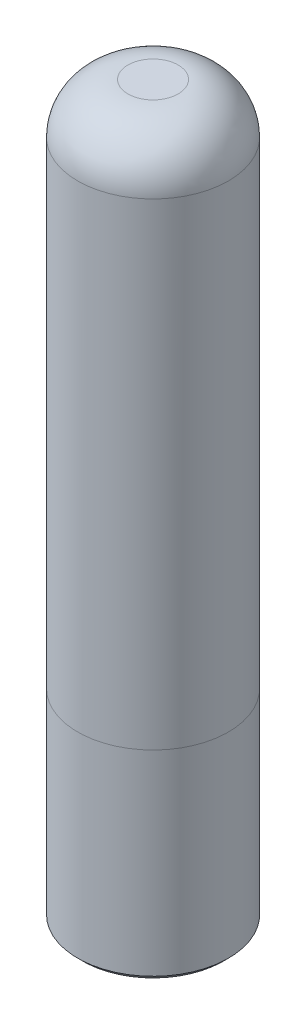
ISO-10303-21;
HEADER;
FILE_DESCRIPTION(('STEP AP214'),'2;1');
FILE_NAME('part.step','',(''),(''),'','','');
FILE_SCHEMA(('AUTOMOTIVE_DESIGN { 1 0 10303 214 1 1 1 1 }'));
ENDSEC;
DATA;
#1=APPLICATION_CONTEXT('core data for automotive mechanical design processes');
#2=APPLICATION_PROTOCOL_DEFINITION('international standard','automotive_design',2000,#1);
#3=PRODUCT_CONTEXT('',#1,'mechanical');
#4=PRODUCT('Part','Part','',(#3));
#5=PRODUCT_RELATED_PRODUCT_CATEGORY('part','',(#4));
#6=PRODUCT_DEFINITION_FORMATION('','',#4);
#7=PRODUCT_DEFINITION_CONTEXT('part definition',#1,'design');
#8=PRODUCT_DEFINITION('design','',#6,#7);
#9=PRODUCT_DEFINITION_SHAPE('','',#8);
#10=(LENGTH_UNIT() NAMED_UNIT(*) SI_UNIT(.MILLI.,.METRE.));
#11=(NAMED_UNIT(*) PLANE_ANGLE_UNIT() SI_UNIT($,.RADIAN.));
#12=(NAMED_UNIT(*) SI_UNIT($,.STERADIAN.) SOLID_ANGLE_UNIT());
#13=UNCERTAINTY_MEASURE_WITH_UNIT(LENGTH_MEASURE(1.E-05),#10,'distance_accuracy_value','');
#14=(GEOMETRIC_REPRESENTATION_CONTEXT(3) GLOBAL_UNCERTAINTY_ASSIGNED_CONTEXT((#13)) GLOBAL_UNIT_ASSIGNED_CONTEXT((#10,
#11,#12)) REPRESENTATION_CONTEXT('',''));
#15=CARTESIAN_POINT('',(0.,0.,0.));
#16=DIRECTION('',(0.,0.,1.));
#17=DIRECTION('',(1.,0.,0.));
#18=AXIS2_PLACEMENT_3D('',#15,#16,#17);
#19=CARTESIAN_POINT('',(0.,-4.,0.));
#20=DIRECTION('',(0.,1.,0.));
#21=DIRECTION('',(0.,0.,1.));
#22=AXIS2_PLACEMENT_3D('',#19,#20,#21);
#23=CYLINDRICAL_SURFACE('',#22,1.5);
#24=CARTESIAN_POINT('',(0.,-3.9,0.));
#25=DIRECTION('',(0.,-1.,0.));
#26=DIRECTION('',(0.,0.,-1.));
#27=AXIS2_PLACEMENT_3D('',#24,#25,#26);
#28=CIRCLE('',#27,1.5);
#29=CARTESIAN_POINT('',(0.,-3.9,-1.5));
#30=VERTEX_POINT('',#29);
#31=EDGE_CURVE('E11',#30,#30,#28,.F.);
#32=ORIENTED_EDGE('',*,*,#31,.T.);
#33=EDGE_LOOP('',(#32));
#34=FACE_BOUND('',#33,.T.);
#35=CARTESIAN_POINT('',(0.,0.,0.));
#36=DIRECTION('',(0.,-1.,0.));
#37=DIRECTION('',(0.,0.,-1.));
#38=AXIS2_PLACEMENT_3D('',#35,#36,#37);
#39=CIRCLE('',#38,1.5);
#40=CARTESIAN_POINT('',(0.,0.,-1.5));
#41=VERTEX_POINT('',#40);
#42=EDGE_CURVE('E61',#41,#41,#39,.T.);
#43=ORIENTED_EDGE('',*,*,#42,.T.);
#44=EDGE_LOOP('',(#43));
#45=FACE_BOUND('',#44,.T.);
#46=ADVANCED_FACE('F49',(#34,#45),#23,.T.);
#47=CARTESIAN_POINT('',(0.,-4.,0.));
#48=DIRECTION('',(0.,-1.,0.));
#49=DIRECTION('',(0.,0.,-1.));
#50=AXIS2_PLACEMENT_3D('',#47,#48,#49);
#51=PLANE('',#50);
#52=CARTESIAN_POINT('',(0.,-4.,0.));
#53=DIRECTION('',(0.,-1.,0.));
#54=DIRECTION('',(0.,0.,-1.));
#55=AXIS2_PLACEMENT_3D('',#52,#53,#54);
#56=CIRCLE('',#55,1.4);
#57=CARTESIAN_POINT('',(0.,-4.,-1.4));
#58=VERTEX_POINT('',#57);
#59=EDGE_CURVE('E57',#58,#58,#56,.T.);
#60=ORIENTED_EDGE('',*,*,#59,.T.);
#61=EDGE_LOOP('',(#60));
#62=FACE_BOUND('',#61,.T.);
#63=ADVANCED_FACE('F71',(#62),#51,.T.);
#64=CARTESIAN_POINT('',(0.,0.,0.));
#65=DIRECTION('',(0.,-1.,0.));
#66=DIRECTION('',(0.,0.,-1.));
#67=AXIS2_PLACEMENT_3D('',#64,#65,#66);
#68=PLANE('',#67);
#69=ORIENTED_EDGE('',*,*,#42,.F.);
#70=EDGE_LOOP('',(#69));
#71=FACE_BOUND('',#70,.T.);
#72=ADVANCED_FACE('F69',(#71),#68,.F.);
#73=CARTESIAN_POINT('',(0.,-4.,0.));
#74=DIRECTION('',(0.,1.,0.));
#75=DIRECTION('',(0.,0.,1.));
#76=AXIS2_PLACEMENT_3D('',#73,#74,#75);
#77=CONICAL_SURFACE('',#76,1.4,0.785398163397453);
#78=ORIENTED_EDGE('',*,*,#31,.F.);
#79=EDGE_LOOP('',(#78));
#80=FACE_BOUND('',#79,.T.);
#81=ORIENTED_EDGE('',*,*,#59,.F.);
#82=EDGE_LOOP('',(#81));
#83=FACE_BOUND('',#82,.T.);
#84=ADVANCED_FACE('F52',(#80,#83),#77,.T.);
#85=CLOSED_SHELL('',(#46,#63,#72,#84));
#86=MANIFOLD_SOLID_BREP('B2',#85);
#87=CARTESIAN_POINT('',(0.,10.5,0.));
#88=DIRECTION('',(0.,-1.,0.));
#89=DIRECTION('',(0.,0.,-1.));
#90=AXIS2_PLACEMENT_3D('',#87,#88,#89);
#91=CYLINDRICAL_SURFACE('',#90,1.5);
#92=CARTESIAN_POINT('',(0.,9.5,0.));
#93=DIRECTION('',(0.,1.,0.));
#94=DIRECTION('',(0.,0.,1.));
#95=AXIS2_PLACEMENT_3D('',#92,#93,#94);
#96=CIRCLE('',#95,1.5);
#97=CARTESIAN_POINT('',(0.,9.5,-1.5));
#98=VERTEX_POINT('',#97);
#99=EDGE_CURVE('E48',#98,#98,#96,.F.);
#100=CARTESIAN_POINT('',(0.,0.,0.));
#101=DIRECTION('',(0.,1.,0.));
#102=DIRECTION('',(0.,0.,1.));
#103=AXIS2_PLACEMENT_3D('',#100,#101,#102);
#104=CIRCLE('',#103,1.5);
#105=CARTESIAN_POINT('',(0.,0.,-1.5));
#106=VERTEX_POINT('',#105);
#107=EDGE_CURVE('E126',#106,#106,#104,.T.);
#108=CARTESIAN_POINT('',(0.,9.5,-1.5));
#109=CARTESIAN_POINT('',(0.,9.40104166666667,-1.5));
#110=CARTESIAN_POINT('',(0.,9.30208333333333,-1.5));
#111=CARTESIAN_POINT('',(0.,9.10416666666667,-1.5));
#112=CARTESIAN_POINT('',(0.,9.00520833333333,-1.5));
#113=CARTESIAN_POINT('',(0.,8.80729166666667,-1.5));
#114=CARTESIAN_POINT('',(0.,8.70833333333333,-1.5));
#115=CARTESIAN_POINT('',(0.,8.51041666666667,-1.5));
#116=CARTESIAN_POINT('',(0.,8.41145833333333,-1.5));
#117=CARTESIAN_POINT('',(0.,8.21354166666667,-1.5));
#118=CARTESIAN_POINT('',(0.,8.11458333333333,-1.5));
#119=CARTESIAN_POINT('',(0.,7.91666666666667,-1.5));
#120=CARTESIAN_POINT('',(0.,7.81770833333333,-1.5));
#121=CARTESIAN_POINT('',(0.,7.61979166666667,-1.5));
#122=CARTESIAN_POINT('',(0.,7.52083333333333,-1.5));
#123=CARTESIAN_POINT('',(0.,7.32291666666667,-1.5));
#124=CARTESIAN_POINT('',(0.,7.22395833333333,-1.5));
#125=CARTESIAN_POINT('',(0.,7.02604166666667,-1.5));
#126=CARTESIAN_POINT('',(0.,6.92708333333333,-1.5));
#127=CARTESIAN_POINT('',(0.,6.72916666666667,-1.5));
#128=CARTESIAN_POINT('',(0.,6.63020833333333,-1.5));
#129=CARTESIAN_POINT('',(0.,6.43229166666667,-1.5));
#130=CARTESIAN_POINT('',(0.,6.33333333333333,-1.5));
#131=CARTESIAN_POINT('',(0.,6.13541666666667,-1.5));
#132=CARTESIAN_POINT('',(0.,6.03645833333333,-1.5));
#133=CARTESIAN_POINT('',(0.,5.83854166666667,-1.5));
#134=CARTESIAN_POINT('',(0.,5.73958333333333,-1.5));
#135=CARTESIAN_POINT('',(0.,5.54166666666667,-1.5));
#136=CARTESIAN_POINT('',(0.,5.44270833333333,-1.5));
#137=CARTESIAN_POINT('',(0.,5.24479166666667,-1.5));
#138=CARTESIAN_POINT('',(0.,5.14583333333333,-1.5));
#139=CARTESIAN_POINT('',(0.,4.94791666666667,-1.5));
#140=CARTESIAN_POINT('',(0.,4.84895833333333,-1.5));
#141=CARTESIAN_POINT('',(0.,4.65104166666667,-1.5));
#142=CARTESIAN_POINT('',(0.,4.55208333333333,-1.5));
#143=CARTESIAN_POINT('',(0.,4.35416666666667,-1.5));
#144=CARTESIAN_POINT('',(0.,4.25520833333333,-1.5));
#145=CARTESIAN_POINT('',(0.,4.05729166666667,-1.5));
#146=CARTESIAN_POINT('',(0.,3.95833333333333,-1.5));
#147=CARTESIAN_POINT('',(0.,3.76041666666667,-1.5));
#148=CARTESIAN_POINT('',(0.,3.66145833333333,-1.5));
#149=CARTESIAN_POINT('',(0.,3.46354166666667,-1.5));
#150=CARTESIAN_POINT('',(0.,3.36458333333333,-1.5));
#151=CARTESIAN_POINT('',(0.,3.16666666666667,-1.5));
#152=CARTESIAN_POINT('',(0.,3.06770833333333,-1.5));
#153=CARTESIAN_POINT('',(0.,2.86979166666667,-1.5));
#154=CARTESIAN_POINT('',(0.,2.77083333333333,-1.5));
#155=CARTESIAN_POINT('',(0.,2.57291666666667,-1.5));
#156=CARTESIAN_POINT('',(0.,2.47395833333333,-1.5));
#157=CARTESIAN_POINT('',(0.,2.27604166666667,-1.5));
#158=CARTESIAN_POINT('',(0.,2.17708333333333,-1.5));
#159=CARTESIAN_POINT('',(0.,1.97916666666667,-1.5));
#160=CARTESIAN_POINT('',(0.,1.88020833333333,-1.5));
#161=CARTESIAN_POINT('',(0.,1.68229166666667,-1.5));
#162=CARTESIAN_POINT('',(0.,1.58333333333333,-1.5));
#163=CARTESIAN_POINT('',(0.,1.38541666666667,-1.5));
#164=CARTESIAN_POINT('',(0.,1.28645833333333,-1.5));
#165=CARTESIAN_POINT('',(0.,1.08854166666667,-1.5));
#166=CARTESIAN_POINT('',(0.,0.989583333333334,-1.5));
#167=CARTESIAN_POINT('',(0.,0.791666666666667,-1.5));
#168=CARTESIAN_POINT('',(0.,0.692708333333334,-1.5));
#169=CARTESIAN_POINT('',(0.,0.494791666666667,-1.5));
#170=CARTESIAN_POINT('',(0.,0.395833333333334,-1.5));
#171=CARTESIAN_POINT('',(0.,0.197916666666667,-1.5));
#172=CARTESIAN_POINT('',(0.,0.0989583333333335,-1.5));
#173=CARTESIAN_POINT('',(0.,0.,-1.5));
#174=B_SPLINE_CURVE_WITH_KNOTS('',3,(#108,#109,#110,#111,#112,#113,#114,#115,#116,#117,#118,
#119,#120,#121,#122,#123,#124,#125,#126,#127,#128,#129,#130,#131,#132,#133,#134,#135,#136,#137,
#138,#139,#140,#141,#142,#143,#144,#145,#146,#147,#148,#149,#150,#151,#152,#153,#154,#155,#156,
#157,#158,#159,#160,#161,#162,#163,#164,#165,#166,#167,#168,#169,#170,#171,#172,#173),
.UNSPECIFIED.,.F.,.F.,(4,2,2,2,2,2,2,2,2,2,2,2,2,2,2,2,2,2,2,2,2,2,2,2,2,2,2,2,2,2,2,2,4),(0.,
0.296875,0.593749999999999,0.890624999999999,1.1875,1.484375,1.78125,2.078125,2.375,2.671875,
2.96875,3.265625,3.5625,3.859375,4.15625,4.453125,4.75,5.046875,5.34375,5.640625,5.9375,
6.234375,6.53125,6.828125,7.125,7.421875,7.71875,8.015625,8.3125,8.609375,8.90625,9.203125,9.5),.UNSPECIFIED.);
#175=EDGE_CURVE('BSEAM115',#98,#106,#174,.T.);
#176=ORIENTED_EDGE('',*,*,#99,.T.);
#177=ORIENTED_EDGE('',*,*,#107,.T.);
#178=ORIENTED_EDGE('',*,*,#175,.T.);
#179=ORIENTED_EDGE('',*,*,#175,.F.);
#180=EDGE_LOOP('',(#176,#178,#177,#179));
#181=FACE_BOUND('',#180,.T.);
#182=ADVANCED_FACE('F115',(#181),#91,.T.);
#183=CARTESIAN_POINT('',(0.,10.5,0.));
#184=DIRECTION('',(0.,1.,0.));
#185=DIRECTION('',(0.,0.,1.));
#186=AXIS2_PLACEMENT_3D('',#183,#184,#185);
#187=PLANE('',#186);
#188=CARTESIAN_POINT('',(0.,10.5,0.));
#189=DIRECTION('',(0.,1.,0.));
#190=DIRECTION('',(0.,0.,1.));
#191=AXIS2_PLACEMENT_3D('',#188,#189,#190);
#192=CIRCLE('',#191,0.5);
#193=CARTESIAN_POINT('',(0.,10.5,0.5));
#194=VERTEX_POINT('',#193);
#195=EDGE_CURVE('E122',#194,#194,#192,.T.);
#196=ORIENTED_EDGE('',*,*,#195,.T.);
#197=EDGE_LOOP('',(#196));
#198=FACE_BOUND('',#197,.T.);
#199=ADVANCED_FACE('F136',(#198),#187,.T.);
#200=CARTESIAN_POINT('',(0.,0.,0.));
#201=DIRECTION('',(0.,1.,0.));
#202=DIRECTION('',(0.,0.,1.));
#203=AXIS2_PLACEMENT_3D('',#200,#201,#202);
#204=PLANE('',#203);
#205=ORIENTED_EDGE('',*,*,#107,.F.);
#206=EDGE_LOOP('',(#205));
#207=FACE_BOUND('',#206,.T.);
#208=ADVANCED_FACE('F134',(#207),#204,.F.);
#209=CARTESIAN_POINT('',(0.,9.5,0.));
#210=DIRECTION('',(0.,1.,0.));
#211=DIRECTION('',(0.,0.,1.));
#212=AXIS2_PLACEMENT_3D('',#209,#210,#211);
#213=DEGENERATE_TOROIDAL_SURFACE('',#212,0.5,1.,.T.);
#214=ORIENTED_EDGE('',*,*,#99,.F.);
#215=EDGE_LOOP('',(#214));
#216=FACE_BOUND('',#215,.T.);
#217=ORIENTED_EDGE('',*,*,#195,.F.);
#218=EDGE_LOOP('',(#217));
#219=FACE_BOUND('',#218,.T.);
#220=ADVANCED_FACE('F117',(#216,#219),#213,.T.);
#221=CLOSED_SHELL('',(#182,#199,#208,#220));
#222=MANIFOLD_SOLID_BREP('B6',#221);
#223=ADVANCED_BREP_SHAPE_REPRESENTATION('',(#18,#86,#222),#14);
#224=SHAPE_DEFINITION_REPRESENTATION(#9,#223);
ENDSEC;
END-ISO-10303-21;
